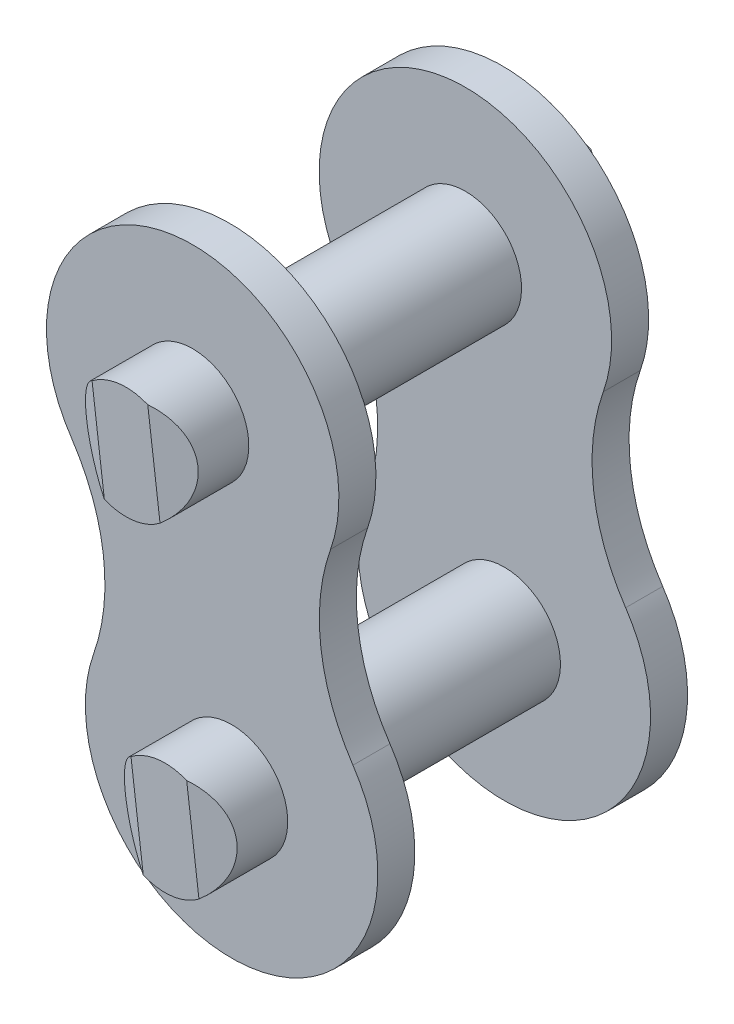
ISO-10303-21;
HEADER;
FILE_DESCRIPTION(('STEP AP214'),'2;1');
FILE_NAME('part.step','',(''),(''),'','','');
FILE_SCHEMA(('AUTOMOTIVE_DESIGN { 1 0 10303 214 1 1 1 1 }'));
ENDSEC;
DATA;
#1=APPLICATION_CONTEXT('core data for automotive mechanical design processes');
#2=APPLICATION_PROTOCOL_DEFINITION('international standard','automotive_design',2000,#1);
#3=PRODUCT_CONTEXT('',#1,'mechanical');
#4=PRODUCT('Part','Part','',(#3));
#5=PRODUCT_RELATED_PRODUCT_CATEGORY('part','',(#4));
#6=PRODUCT_DEFINITION_FORMATION('','',#4);
#7=PRODUCT_DEFINITION_CONTEXT('part definition',#1,'design');
#8=PRODUCT_DEFINITION('design','',#6,#7);
#9=PRODUCT_DEFINITION_SHAPE('','',#8);
#10=(LENGTH_UNIT() NAMED_UNIT(*) SI_UNIT(.MILLI.,.METRE.));
#11=(NAMED_UNIT(*) PLANE_ANGLE_UNIT() SI_UNIT($,.RADIAN.));
#12=(NAMED_UNIT(*) SI_UNIT($,.STERADIAN.) SOLID_ANGLE_UNIT());
#13=UNCERTAINTY_MEASURE_WITH_UNIT(LENGTH_MEASURE(1.E-05),#10,'distance_accuracy_value','');
#14=(GEOMETRIC_REPRESENTATION_CONTEXT(3) GLOBAL_UNCERTAINTY_ASSIGNED_CONTEXT((#13)) GLOBAL_UNIT_ASSIGNED_CONTEXT((#10,
#11,#12)) REPRESENTATION_CONTEXT('',''));
#15=CARTESIAN_POINT('',(0.,0.,0.));
#16=DIRECTION('',(0.,0.,1.));
#17=DIRECTION('',(1.,0.,0.));
#18=AXIS2_PLACEMENT_3D('',#15,#16,#17);
#19=CARTESIAN_POINT('',(84.5620491825673,83.6866241505442,-131.392489073474));
#20=DIRECTION('',(0.496004780892395,0.0630813548672462,0.866025403784439));
#21=DIRECTION('',(0.126162709734492,-0.99200956178479,0.));
#22=AXIS2_PLACEMENT_3D('',#19,#20,#21);
#23=PLANE('',#22);
#24=CARTESIAN_POINT('',(83.5922035314926,98.1827550847188,-131.892921853051));
#25=DIRECTION('',(-0.496004780892394,-0.0630813548672461,-0.866025403784439));
#26=DIRECTION('',(-0.859105481302697,-0.109260111640353,0.5));
#27=AXIS2_PLACEMENT_3D('',#24,#25,#26);
#28=ELLIPSE('',#27,1.3344874122049,1.1557);
#29=CARTESIAN_POINT('',(83.145242717238,97.1169837581572,-131.5593));
#30=VERTEX_POINT('',#29);
#31=CARTESIAN_POINT('',(82.8926988951925,99.1027201676403,-131.5593));
#32=VERTEX_POINT('',#31);
#33=EDGE_CURVE('E255',#30,#32,#28,.T.);
#34=ORIENTED_EDGE('',*,*,#33,.T.);
#35=DIRECTION('',(-0.126162709734492,0.99200956178479,0.));
#36=VECTOR('',#35,1.);
#37=CARTESIAN_POINT('',(84.8486655452059,83.7230757114542,-131.5593));
#38=LINE('',#37,#36);
#39=EDGE_CURVE('E276',#30,#32,#38,.T.);
#40=ORIENTED_EDGE('',*,*,#39,.F.);
#41=EDGE_LOOP('',(#34,#40));
#42=FACE_BOUND('',#41,.T.);
#43=ADVANCED_FACE('F17',(#42),#23,.F.);
#44=CARTESIAN_POINT('',(86.2817473583993,83.9053335160044,-131.392489073474));
#45=DIRECTION('',(0.496004780892396,0.0630813548672464,-0.866025403784438));
#46=DIRECTION('',(0.,-0.997357671646627,-0.0726476070329821));
#47=AXIS2_PLACEMENT_3D('',#44,#45,#46);
#48=PLANE('',#47);
#49=CARTESIAN_POINT('',(83.5922035314926,98.1827550847188,-131.892921853051));
#50=DIRECTION('',(-0.496004780892395,-0.0630813548672463,0.866025403784439));
#51=DIRECTION('',(0.859105481302696,0.109260111640353,0.5));
#52=AXIS2_PLACEMENT_3D('',#49,#50,#51);
#53=ELLIPSE('',#52,1.3344874122049,1.1557);
#54=CARTESIAN_POINT('',(84.2917081677927,97.2627900017974,-131.5593));
#55=VERTEX_POINT('',#54);
#56=CARTESIAN_POINT('',(84.0391643457472,99.2485264112804,-131.5593));
#57=VERTEX_POINT('',#56);
#58=EDGE_CURVE('E243',#55,#57,#53,.T.);
#59=ORIENTED_EDGE('',*,*,#58,.F.);
#60=DIRECTION('',(-0.126162709734492,0.99200956178479,0.));
#61=VECTOR('',#60,1.);
#62=CARTESIAN_POINT('',(85.9951309957606,83.8688819550943,-131.5593));
#63=LINE('',#62,#61);
#64=EDGE_CURVE('E279',#55,#57,#63,.T.);
#65=ORIENTED_EDGE('',*,*,#64,.T.);
#66=EDGE_LOOP('',(#59,#65));
#67=FACE_BOUND('',#66,.T.);
#68=ADVANCED_FACE('F416',(#67),#48,.T.);
#69=CARTESIAN_POINT('',(84.5620491825673,83.6866241505442,-131.392489073474));
#70=DIRECTION('',(0.496004780892395,0.0630813548672462,0.866025403784439));
#71=DIRECTION('',(0.126162709734492,-0.99200956178479,0.));
#72=AXIS2_PLACEMENT_3D('',#69,#70,#71);
#73=PLANE('',#72);
#74=CARTESIAN_POINT('',(82.7910703246785,104.482015802052,-131.892921853051));
#75=DIRECTION('',(-0.496004780892394,-0.0630813548672461,-0.866025403784439));
#76=DIRECTION('',(-0.859105481302697,-0.109260111640353,0.5));
#77=AXIS2_PLACEMENT_3D('',#74,#75,#76);
#78=ELLIPSE('',#77,1.3344874122049,1.1557);
#79=CARTESIAN_POINT('',(82.344109510424,103.416244475491,-131.5593));
#80=VERTEX_POINT('',#79);
#81=CARTESIAN_POINT('',(82.0915656883785,105.401980884974,-131.5593));
#82=VERTEX_POINT('',#81);
#83=EDGE_CURVE('E269',#80,#82,#78,.T.);
#84=ORIENTED_EDGE('',*,*,#83,.T.);
#85=DIRECTION('',(-0.126162709734492,0.99200956178479,0.));
#86=VECTOR('',#85,1.);
#87=CARTESIAN_POINT('',(84.8486655452059,83.7230757114542,-131.5593));
#88=LINE('',#87,#86);
#89=EDGE_CURVE('E259',#80,#82,#88,.T.);
#90=ORIENTED_EDGE('',*,*,#89,.F.);
#91=EDGE_LOOP('',(#84,#90));
#92=FACE_BOUND('',#91,.T.);
#93=ADVANCED_FACE('F422',(#92),#73,.F.);
#94=CARTESIAN_POINT('',(86.2817473583993,83.9053335160044,-131.392489073474));
#95=DIRECTION('',(0.496004780892396,0.0630813548672464,-0.866025403784438));
#96=DIRECTION('',(0.,-0.997357671646627,-0.0726476070329821));
#97=AXIS2_PLACEMENT_3D('',#94,#95,#96);
#98=PLANE('',#97);
#99=CARTESIAN_POINT('',(82.7910703246785,104.482015802052,-131.892921853051));
#100=DIRECTION('',(-0.496004780892395,-0.0630813548672463,0.866025403784439));
#101=DIRECTION('',(0.859105481302696,0.109260111640353,0.5));
#102=AXIS2_PLACEMENT_3D('',#99,#100,#101);
#103=ELLIPSE('',#102,1.3344874122049,1.1557);
#104=CARTESIAN_POINT('',(83.4905749609786,103.562050719131,-131.5593));
#105=VERTEX_POINT('',#104);
#106=CARTESIAN_POINT('',(83.2380311389331,105.547787128614,-131.5593));
#107=VERTEX_POINT('',#106);
#108=EDGE_CURVE('E268',#105,#107,#103,.T.);
#109=ORIENTED_EDGE('',*,*,#108,.F.);
#110=DIRECTION('',(-0.126162709734492,0.99200956178479,0.));
#111=VECTOR('',#110,1.);
#112=CARTESIAN_POINT('',(85.9951309957606,83.8688819550943,-131.5593));
#113=LINE('',#112,#111);
#114=EDGE_CURVE('E262',#105,#107,#113,.T.);
#115=ORIENTED_EDGE('',*,*,#114,.T.);
#116=EDGE_LOOP('',(#109,#115));
#117=FACE_BOUND('',#116,.T.);
#118=ADVANCED_FACE('F465',(#117),#98,.T.);
#119=CARTESIAN_POINT('',(83.1916369280856,101.332385443386,-129.4257));
#120=DIRECTION('',(0.,0.,-1.));
#121=DIRECTION('',(0.,-1.,0.));
#122=AXIS2_PLACEMENT_3D('',#119,#120,#121);
#123=PLANE('',#122);
#124=CARTESIAN_POINT('',(83.5922035314926,98.1827550847188,-129.4257));
#125=DIRECTION('',(0.,0.,1.));
#126=DIRECTION('',(-0.126162709734492,0.99200956178479,0.));
#127=AXIS2_PLACEMENT_3D('',#124,#125,#126);
#128=CIRCLE('',#127,1.1557);
#129=CARTESIAN_POINT('',(83.4463972878525,99.3292205352735,-129.4257));
#130=VERTEX_POINT('',#129);
#131=EDGE_CURVE('E256',#130,#130,#128,.T.);
#132=ORIENTED_EDGE('',*,*,#131,.F.);
#133=EDGE_LOOP('',(#132));
#134=FACE_BOUND('',#133,.T.);
#135=CARTESIAN_POINT('',(82.7910703246785,104.482015802052,-129.4257));
#136=DIRECTION('',(0.,0.,1.));
#137=DIRECTION('',(-0.126162709734492,0.99200956178479,0.));
#138=AXIS2_PLACEMENT_3D('',#135,#136,#137);
#139=CIRCLE('',#138,1.1557);
#140=CARTESIAN_POINT('',(82.6452640810384,105.628481252607,-129.4257));
#141=VERTEX_POINT('',#140);
#142=EDGE_CURVE('E251',#141,#141,#139,.T.);
#143=ORIENTED_EDGE('',*,*,#142,.F.);
#144=EDGE_LOOP('',(#143));
#145=FACE_BOUND('',#144,.T.);
#146=CARTESIAN_POINT('',(89.4631955168003,102.129995523259,-129.4257));
#147=DIRECTION('',(0.,0.,1.));
#148=DIRECTION('',(-0.126162709734492,0.99200956178479,0.));
#149=AXIS2_PLACEMENT_3D('',#146,#147,#148);
#150=CIRCLE('',#149,4.06464973628698);
#151=CARTESIAN_POINT('',(85.6297569357515,103.481337864794,-129.4257));
#152=VERTEX_POINT('',#151);
#153=CARTESIAN_POINT('',(86.0900443037383,99.8621268382347,-129.4257));
#154=VERTEX_POINT('',#153);
#155=EDGE_CURVE('E299',#152,#154,#150,.T.);
#156=ORIENTED_EDGE('',*,*,#155,.F.);
#157=CARTESIAN_POINT('',(82.7910703246785,104.482015802052,-129.4257));
#158=DIRECTION('',(0.,0.,1.));
#159=DIRECTION('',(-0.126162709734492,0.99200956178479,0.));
#160=AXIS2_PLACEMENT_3D('',#157,#158,#159);
#161=CIRCLE('',#160,3.0099);
#162=CARTESIAN_POINT('',(80.2932295524328,102.802644048536,-129.4257));
#163=VERTEX_POINT('',#162);
#164=EDGE_CURVE('E287',#152,#163,#161,.T.);
#165=ORIENTED_EDGE('',*,*,#164,.T.);
#166=CARTESIAN_POINT('',(76.9200783393709,100.534775363512,-129.4257));
#167=DIRECTION('',(0.,0.,1.));
#168=DIRECTION('',(-0.126162709734492,0.99200956178479,0.));
#169=AXIS2_PLACEMENT_3D('',#166,#167,#168);
#170=CIRCLE('',#169,4.06464973628691);
#171=CARTESIAN_POINT('',(80.7535169204197,99.1834330219771,-129.4257));
#172=VERTEX_POINT('',#171);
#173=EDGE_CURVE('E313',#172,#163,#170,.T.);
#174=ORIENTED_EDGE('',*,*,#173,.F.);
#175=CARTESIAN_POINT('',(83.5922035314926,98.1827550847188,-129.4257));
#176=DIRECTION('',(0.,0.,1.));
#177=DIRECTION('',(-0.126162709734492,0.99200956178479,0.));
#178=AXIS2_PLACEMENT_3D('',#175,#176,#177);
#179=CIRCLE('',#178,3.0099);
#180=EDGE_CURVE('E25',#172,#154,#179,.T.);
#181=ORIENTED_EDGE('',*,*,#180,.T.);
#182=EDGE_LOOP('',(#156,#165,#174,#181));
#183=FACE_BOUND('',#182,.T.);
#184=ADVANCED_FACE('F329',(#134,#145,#183),#123,.F.);
#185=CARTESIAN_POINT('',(83.1916369280856,101.332385443386,-130.1877));
#186=DIRECTION('',(0.,0.,-1.));
#187=DIRECTION('',(0.,-1.,0.));
#188=AXIS2_PLACEMENT_3D('',#185,#186,#187);
#189=PLANE('',#188);
#190=CARTESIAN_POINT('',(83.5922035314926,98.1827550847188,-130.1877));
#191=DIRECTION('',(0.,0.,1.));
#192=DIRECTION('',(-0.126162709734492,0.99200956178479,0.));
#193=AXIS2_PLACEMENT_3D('',#190,#191,#192);
#194=CIRCLE('',#193,1.1557);
#195=CARTESIAN_POINT('',(83.4463972878525,99.3292205352735,-130.1877));
#196=VERTEX_POINT('',#195);
#197=EDGE_CURVE('E252',#196,#196,#194,.T.);
#198=ORIENTED_EDGE('',*,*,#197,.T.);
#199=EDGE_LOOP('',(#198));
#200=FACE_BOUND('',#199,.T.);
#201=CARTESIAN_POINT('',(82.7910703246785,104.482015802052,-130.1877));
#202=DIRECTION('',(0.,0.,1.));
#203=DIRECTION('',(-0.126162709734492,0.99200956178479,0.));
#204=AXIS2_PLACEMENT_3D('',#201,#202,#203);
#205=CIRCLE('',#204,1.1557);
#206=CARTESIAN_POINT('',(82.6452640810384,105.628481252607,-130.1877));
#207=VERTEX_POINT('',#206);
#208=EDGE_CURVE('E282',#207,#207,#205,.T.);
#209=ORIENTED_EDGE('',*,*,#208,.T.);
#210=EDGE_LOOP('',(#209));
#211=FACE_BOUND('',#210,.T.);
#212=CARTESIAN_POINT('',(89.4631955168003,102.129995523259,-130.1877));
#213=DIRECTION('',(0.,0.,1.));
#214=DIRECTION('',(-0.126162709734492,0.99200956178479,0.));
#215=AXIS2_PLACEMENT_3D('',#212,#213,#214);
#216=CIRCLE('',#215,4.06464973628698);
#217=CARTESIAN_POINT('',(85.6297569357515,103.481337864794,-130.1877));
#218=VERTEX_POINT('',#217);
#219=CARTESIAN_POINT('',(86.0900443037383,99.8621268382347,-130.1877));
#220=VERTEX_POINT('',#219);
#221=EDGE_CURVE('E288',#218,#220,#216,.T.);
#222=ORIENTED_EDGE('',*,*,#221,.T.);
#223=CARTESIAN_POINT('',(83.5922035314926,98.1827550847188,-130.1877));
#224=DIRECTION('',(0.,0.,1.));
#225=DIRECTION('',(-0.126162709734492,0.99200956178479,0.));
#226=AXIS2_PLACEMENT_3D('',#223,#224,#225);
#227=CIRCLE('',#226,3.0099);
#228=CARTESIAN_POINT('',(80.7535169204197,99.1834330219771,-130.1877));
#229=VERTEX_POINT('',#228);
#230=EDGE_CURVE('E11',#229,#220,#227,.T.);
#231=ORIENTED_EDGE('',*,*,#230,.F.);
#232=CARTESIAN_POINT('',(76.9200783393709,100.534775363512,-130.1877));
#233=DIRECTION('',(0.,0.,1.));
#234=DIRECTION('',(-0.126162709734492,0.99200956178479,0.));
#235=AXIS2_PLACEMENT_3D('',#232,#233,#234);
#236=CIRCLE('',#235,4.06464973628691);
#237=CARTESIAN_POINT('',(80.2932295524328,102.802644048536,-130.1877));
#238=VERTEX_POINT('',#237);
#239=EDGE_CURVE('E319',#229,#238,#236,.T.);
#240=ORIENTED_EDGE('',*,*,#239,.T.);
#241=CARTESIAN_POINT('',(82.7910703246785,104.482015802052,-130.1877));
#242=DIRECTION('',(0.,0.,1.));
#243=DIRECTION('',(-0.126162709734492,0.99200956178479,0.));
#244=AXIS2_PLACEMENT_3D('',#241,#242,#243);
#245=CIRCLE('',#244,3.0099);
#246=EDGE_CURVE('E308',#218,#238,#245,.T.);
#247=ORIENTED_EDGE('',*,*,#246,.F.);
#248=EDGE_LOOP('',(#222,#231,#240,#247));
#249=FACE_BOUND('',#248,.T.);
#250=ADVANCED_FACE('F459',(#200,#211,#249),#189,.T.);
#251=CARTESIAN_POINT('',(83.5922035314926,98.1827550847188,-130.1877));
#252=DIRECTION('',(0.,0.,1.));
#253=DIRECTION('',(0.126162709734492,-0.99200956178479,0.));
#254=AXIS2_PLACEMENT_3D('',#251,#252,#253);
#255=CYLINDRICAL_SURFACE('',#254,3.0099);
#256=ORIENTED_EDGE('',*,*,#180,.F.);
#257=DIRECTION('',(0.,0.,1.));
#258=VECTOR('',#257,1.);
#259=CARTESIAN_POINT('',(80.7535169204197,99.1834330219771,-130.1877));
#260=LINE('',#259,#258);
#261=EDGE_CURVE('E322',#229,#172,#260,.T.);
#262=ORIENTED_EDGE('',*,*,#261,.F.);
#263=ORIENTED_EDGE('',*,*,#230,.T.);
#264=DIRECTION('',(0.,0.,1.));
#265=VECTOR('',#264,1.);
#266=CARTESIAN_POINT('',(86.0900443037383,99.8621268382347,-130.1877));
#267=LINE('',#266,#265);
#268=EDGE_CURVE('E300',#220,#154,#267,.T.);
#269=ORIENTED_EDGE('',*,*,#268,.T.);
#270=EDGE_LOOP('',(#256,#262,#263,#269));
#271=FACE_BOUND('',#270,.T.);
#272=ADVANCED_FACE('F332',(#271),#255,.T.);
#273=CARTESIAN_POINT('',(76.9200783393709,100.534775363512,-130.1877));
#274=DIRECTION('',(0.,0.,1.));
#275=DIRECTION('',(0.126162709734492,-0.99200956178479,0.));
#276=AXIS2_PLACEMENT_3D('',#273,#274,#275);
#277=CYLINDRICAL_SURFACE('',#276,4.06464973628691);
#278=ORIENTED_EDGE('',*,*,#173,.T.);
#279=DIRECTION('',(0.,0.,1.));
#280=VECTOR('',#279,1.);
#281=CARTESIAN_POINT('',(80.2932295524328,102.802644048536,-130.1877));
#282=LINE('',#281,#280);
#283=EDGE_CURVE('E309',#238,#163,#282,.T.);
#284=ORIENTED_EDGE('',*,*,#283,.F.);
#285=ORIENTED_EDGE('',*,*,#239,.F.);
#286=ORIENTED_EDGE('',*,*,#261,.T.);
#287=EDGE_LOOP('',(#278,#284,#285,#286));
#288=FACE_BOUND('',#287,.T.);
#289=ADVANCED_FACE('F453',(#288),#277,.F.);
#290=CARTESIAN_POINT('',(82.7910703246785,104.482015802052,-130.1877));
#291=DIRECTION('',(0.,0.,1.));
#292=DIRECTION('',(0.126162709734492,-0.99200956178479,0.));
#293=AXIS2_PLACEMENT_3D('',#290,#291,#292);
#294=CYLINDRICAL_SURFACE('',#293,3.0099);
#295=ORIENTED_EDGE('',*,*,#164,.F.);
#296=DIRECTION('',(0.,0.,1.));
#297=VECTOR('',#296,1.);
#298=CARTESIAN_POINT('',(85.6297569357515,103.481337864794,-130.1877));
#299=LINE('',#298,#297);
#300=EDGE_CURVE('E283',#218,#152,#299,.T.);
#301=ORIENTED_EDGE('',*,*,#300,.F.);
#302=ORIENTED_EDGE('',*,*,#246,.T.);
#303=ORIENTED_EDGE('',*,*,#283,.T.);
#304=EDGE_LOOP('',(#295,#301,#302,#303));
#305=FACE_BOUND('',#304,.T.);
#306=ADVANCED_FACE('F452',(#305),#294,.T.);
#307=CARTESIAN_POINT('',(89.4631955168003,102.129995523259,-130.1877));
#308=DIRECTION('',(0.,0.,1.));
#309=DIRECTION('',(0.126162709734492,-0.99200956178479,0.));
#310=AXIS2_PLACEMENT_3D('',#307,#308,#309);
#311=CYLINDRICAL_SURFACE('',#310,4.06464973628698);
#312=ORIENTED_EDGE('',*,*,#155,.T.);
#313=ORIENTED_EDGE('',*,*,#268,.F.);
#314=ORIENTED_EDGE('',*,*,#221,.F.);
#315=ORIENTED_EDGE('',*,*,#300,.T.);
#316=EDGE_LOOP('',(#312,#313,#314,#315));
#317=FACE_BOUND('',#316,.T.);
#318=ADVANCED_FACE('F335',(#317),#311,.F.);
#319=CARTESIAN_POINT('',(83.1916369280856,101.332385443386,-131.5593));
#320=DIRECTION('',(0.,0.,-1.));
#321=DIRECTION('',(0.,-1.,0.));
#322=AXIS2_PLACEMENT_3D('',#319,#320,#321);
#323=PLANE('',#322);
#324=ORIENTED_EDGE('',*,*,#89,.T.);
#325=CARTESIAN_POINT('',(82.7910703246785,104.482015802052,-131.5593));
#326=DIRECTION('',(0.,0.,1.));
#327=DIRECTION('',(-0.126162709734492,0.99200956178479,0.));
#328=AXIS2_PLACEMENT_3D('',#325,#326,#327);
#329=CIRCLE('',#328,1.1557);
#330=EDGE_CURVE('E263',#107,#82,#329,.T.);
#331=ORIENTED_EDGE('',*,*,#330,.F.);
#332=ORIENTED_EDGE('',*,*,#114,.F.);
#333=CARTESIAN_POINT('',(82.7910703246785,104.482015802052,-131.5593));
#334=DIRECTION('',(0.,0.,1.));
#335=DIRECTION('',(-0.126162709734492,0.99200956178479,0.));
#336=AXIS2_PLACEMENT_3D('',#333,#334,#335);
#337=CIRCLE('',#336,1.1557);
#338=EDGE_CURVE('E264',#80,#105,#337,.T.);
#339=ORIENTED_EDGE('',*,*,#338,.F.);
#340=EDGE_LOOP('',(#324,#331,#332,#339));
#341=FACE_BOUND('',#340,.T.);
#342=ADVANCED_FACE('F442',(#341),#323,.T.);
#343=CARTESIAN_POINT('',(82.7910703246785,104.482015802052,-131.5593));
#344=DIRECTION('',(0.,0.,1.));
#345=DIRECTION('',(0.126162709734492,-0.99200956178479,0.));
#346=AXIS2_PLACEMENT_3D('',#343,#344,#345);
#347=CYLINDRICAL_SURFACE('',#346,1.1557);
#348=ORIENTED_EDGE('',*,*,#83,.F.);
#349=ORIENTED_EDGE('',*,*,#338,.T.);
#350=ORIENTED_EDGE('',*,*,#108,.T.);
#351=ORIENTED_EDGE('',*,*,#330,.T.);
#352=EDGE_LOOP('',(#348,#349,#350,#351));
#353=FACE_BOUND('',#352,.T.);
#354=ORIENTED_EDGE('',*,*,#208,.F.);
#355=EDGE_LOOP('',(#354));
#356=FACE_BOUND('',#355,.T.);
#357=ADVANCED_FACE('F434',(#353,#356),#347,.T.);
#358=CARTESIAN_POINT('',(83.1916369280856,101.332385443386,-131.5593));
#359=DIRECTION('',(0.,0.,-1.));
#360=DIRECTION('',(0.,-1.,0.));
#361=AXIS2_PLACEMENT_3D('',#358,#359,#360);
#362=PLANE('',#361);
#363=ORIENTED_EDGE('',*,*,#39,.T.);
#364=CARTESIAN_POINT('',(83.5922035314926,98.1827550847188,-131.5593));
#365=DIRECTION('',(0.,0.,1.));
#366=DIRECTION('',(-0.126162709734492,0.99200956178479,0.));
#367=AXIS2_PLACEMENT_3D('',#364,#365,#366);
#368=CIRCLE('',#367,1.1557);
#369=EDGE_CURVE('E247',#57,#32,#368,.T.);
#370=ORIENTED_EDGE('',*,*,#369,.F.);
#371=ORIENTED_EDGE('',*,*,#64,.F.);
#372=CARTESIAN_POINT('',(83.5922035314926,98.1827550847188,-131.5593));
#373=DIRECTION('',(0.,0.,1.));
#374=DIRECTION('',(-0.126162709734492,0.99200956178479,0.));
#375=AXIS2_PLACEMENT_3D('',#372,#373,#374);
#376=CIRCLE('',#375,1.1557);
#377=EDGE_CURVE('E248',#30,#55,#376,.T.);
#378=ORIENTED_EDGE('',*,*,#377,.F.);
#379=EDGE_LOOP('',(#363,#370,#371,#378));
#380=FACE_BOUND('',#379,.T.);
#381=ADVANCED_FACE('F432',(#380),#362,.T.);
#382=CARTESIAN_POINT('',(83.5922035314926,98.1827550847188,-131.5593));
#383=DIRECTION('',(0.,0.,1.));
#384=DIRECTION('',(0.126162709734492,-0.99200956178479,0.));
#385=AXIS2_PLACEMENT_3D('',#382,#383,#384);
#386=CYLINDRICAL_SURFACE('',#385,1.1557);
#387=ORIENTED_EDGE('',*,*,#33,.F.);
#388=ORIENTED_EDGE('',*,*,#377,.T.);
#389=ORIENTED_EDGE('',*,*,#58,.T.);
#390=ORIENTED_EDGE('',*,*,#369,.T.);
#391=EDGE_LOOP('',(#387,#388,#389,#390));
#392=FACE_BOUND('',#391,.T.);
#393=ORIENTED_EDGE('',*,*,#197,.F.);
#394=EDGE_LOOP('',(#393));
#395=FACE_BOUND('',#394,.T.);
#396=ADVANCED_FACE('F427',(#392,#395),#386,.T.);
#397=CARTESIAN_POINT('',(84.5620491825673,83.6866241505442,-122.607510926526));
#398=DIRECTION('',(0.496004780892395,0.0630813548672462,-0.866025403784439));
#399=DIRECTION('',(0.,-0.997357671646627,-0.0726476070329818));
#400=AXIS2_PLACEMENT_3D('',#397,#398,#399);
#401=PLANE('',#400);
#402=CARTESIAN_POINT('',(83.5922035314926,98.1827550847188,-122.107078146949));
#403=DIRECTION('',(0.496004780892394,0.0630813548672461,-0.866025403784439));
#404=DIRECTION('',(-0.859105481302697,-0.109260111640353,-0.5));
#405=AXIS2_PLACEMENT_3D('',#402,#403,#404);
#406=ELLIPSE('',#405,1.3344874122049,1.1557);
#407=CARTESIAN_POINT('',(83.145242717238,97.1169837581572,-122.4407));
#408=VERTEX_POINT('',#407);
#409=CARTESIAN_POINT('',(82.8926988951925,99.1027201676403,-122.4407));
#410=VERTEX_POINT('',#409);
#411=EDGE_CURVE('E350',#408,#410,#406,.T.);
#412=ORIENTED_EDGE('',*,*,#411,.F.);
#413=DIRECTION('',(-0.126162709734492,0.99200956178479,0.));
#414=VECTOR('',#413,1.);
#415=CARTESIAN_POINT('',(84.8486655452059,83.7230757114542,-122.4407));
#416=LINE('',#415,#414);
#417=EDGE_CURVE('E364',#408,#410,#416,.T.);
#418=ORIENTED_EDGE('',*,*,#417,.T.);
#419=EDGE_LOOP('',(#412,#418));
#420=FACE_BOUND('',#419,.T.);
#421=ADVANCED_FACE('F440',(#420),#401,.F.);
#422=CARTESIAN_POINT('',(86.2817473583993,83.9053335160044,-122.607510926526));
#423=DIRECTION('',(0.496004780892396,0.0630813548672464,0.866025403784438));
#424=DIRECTION('',(0.126162709734492,-0.99200956178479,0.));
#425=AXIS2_PLACEMENT_3D('',#422,#423,#424);
#426=PLANE('',#425);
#427=CARTESIAN_POINT('',(83.5922035314926,98.1827550847188,-122.107078146949));
#428=DIRECTION('',(0.496004780892395,0.0630813548672463,0.866025403784439));
#429=DIRECTION('',(0.859105481302696,0.109260111640353,-0.5));
#430=AXIS2_PLACEMENT_3D('',#427,#428,#429);
#431=ELLIPSE('',#430,1.3344874122049,1.1557);
#432=CARTESIAN_POINT('',(84.2917081677927,97.2627900017974,-122.4407));
#433=VERTEX_POINT('',#432);
#434=CARTESIAN_POINT('',(84.0391643457472,99.2485264112804,-122.4407));
#435=VERTEX_POINT('',#434);
#436=EDGE_CURVE('E349',#433,#435,#431,.T.);
#437=ORIENTED_EDGE('',*,*,#436,.T.);
#438=DIRECTION('',(-0.126162709734492,0.99200956178479,0.));
#439=VECTOR('',#438,1.);
#440=CARTESIAN_POINT('',(85.9951309957606,83.8688819550943,-122.4407));
#441=LINE('',#440,#439);
#442=EDGE_CURVE('E371',#433,#435,#441,.T.);
#443=ORIENTED_EDGE('',*,*,#442,.F.);
#444=EDGE_LOOP('',(#437,#443));
#445=FACE_BOUND('',#444,.T.);
#446=ADVANCED_FACE('F504',(#445),#426,.T.);
#447=CARTESIAN_POINT('',(84.5620491825673,83.6866241505442,-122.607510926526));
#448=DIRECTION('',(0.496004780892395,0.0630813548672462,-0.866025403784439));
#449=DIRECTION('',(0.,-0.997357671646627,-0.0726476070329818));
#450=AXIS2_PLACEMENT_3D('',#447,#448,#449);
#451=PLANE('',#450);
#452=CARTESIAN_POINT('',(82.7910703246785,104.482015802052,-122.107078146949));
#453=DIRECTION('',(0.496004780892394,0.0630813548672461,-0.866025403784439));
#454=DIRECTION('',(-0.859105481302697,-0.109260111640353,-0.5));
#455=AXIS2_PLACEMENT_3D('',#452,#453,#454);
#456=ELLIPSE('',#455,1.3344874122049,1.1557);
#457=CARTESIAN_POINT('',(82.344109510424,103.416244475491,-122.4407));
#458=VERTEX_POINT('',#457);
#459=CARTESIAN_POINT('',(82.0915656883785,105.401980884974,-122.4407));
#460=VERTEX_POINT('',#459);
#461=EDGE_CURVE('E379',#458,#460,#456,.T.);
#462=ORIENTED_EDGE('',*,*,#461,.F.);
#463=DIRECTION('',(-0.126162709734492,0.99200956178479,0.));
#464=VECTOR('',#463,1.);
#465=CARTESIAN_POINT('',(84.8486655452059,83.7230757114542,-122.4407));
#466=LINE('',#465,#464);
#467=EDGE_CURVE('E365',#458,#460,#466,.T.);
#468=ORIENTED_EDGE('',*,*,#467,.T.);
#469=EDGE_LOOP('',(#462,#468));
#470=FACE_BOUND('',#469,.T.);
#471=ADVANCED_FACE('F506',(#470),#451,.F.);
#472=CARTESIAN_POINT('',(86.2817473583993,83.9053335160044,-122.607510926526));
#473=DIRECTION('',(0.496004780892396,0.0630813548672464,0.866025403784438));
#474=DIRECTION('',(0.126162709734492,-0.99200956178479,0.));
#475=AXIS2_PLACEMENT_3D('',#472,#473,#474);
#476=PLANE('',#475);
#477=CARTESIAN_POINT('',(82.7910703246785,104.482015802052,-122.107078146949));
#478=DIRECTION('',(0.496004780892395,0.0630813548672463,0.866025403784439));
#479=DIRECTION('',(0.859105481302696,0.109260111640353,-0.5));
#480=AXIS2_PLACEMENT_3D('',#477,#478,#479);
#481=ELLIPSE('',#480,1.3344874122049,1.1557);
#482=CARTESIAN_POINT('',(83.4905749609786,103.562050719131,-122.4407));
#483=VERTEX_POINT('',#482);
#484=CARTESIAN_POINT('',(83.2380311389331,105.547787128614,-122.4407));
#485=VERTEX_POINT('',#484);
#486=EDGE_CURVE('E386',#483,#485,#481,.T.);
#487=ORIENTED_EDGE('',*,*,#486,.T.);
#488=DIRECTION('',(-0.126162709734492,0.99200956178479,0.));
#489=VECTOR('',#488,1.);
#490=CARTESIAN_POINT('',(85.9951309957606,83.8688819550943,-122.4407));
#491=LINE('',#490,#489);
#492=EDGE_CURVE('E360',#483,#485,#491,.T.);
#493=ORIENTED_EDGE('',*,*,#492,.F.);
#494=EDGE_LOOP('',(#487,#493));
#495=FACE_BOUND('',#494,.T.);
#496=ADVANCED_FACE('F511',(#495),#476,.T.);
#497=CARTESIAN_POINT('',(83.5922035314926,98.1827550847188,-122.4407));
#498=DIRECTION('',(0.,0.,-1.));
#499=DIRECTION('',(0.126162709734492,-0.99200956178479,0.));
#500=AXIS2_PLACEMENT_3D('',#497,#498,#499);
#501=CYLINDRICAL_SURFACE('',#500,1.1557);
#502=ORIENTED_EDGE('',*,*,#131,.T.);
#503=EDGE_LOOP('',(#502));
#504=FACE_BOUND('',#503,.T.);
#505=CARTESIAN_POINT('',(83.5922035314926,98.1827550847188,-124.5743));
#506=DIRECTION('',(0.,0.,1.));
#507=DIRECTION('',(-0.126162709734492,0.99200956178479,0.));
#508=AXIS2_PLACEMENT_3D('',#505,#506,#507);
#509=CIRCLE('',#508,1.1557);
#510=CARTESIAN_POINT('',(83.4463972878525,99.3292205352735,-124.5743));
#511=VERTEX_POINT('',#510);
#512=EDGE_CURVE('E242',#511,#511,#509,.T.);
#513=ORIENTED_EDGE('',*,*,#512,.F.);
#514=EDGE_LOOP('',(#513));
#515=FACE_BOUND('',#514,.T.);
#516=ADVANCED_FACE('F518',(#504,#515),#501,.T.);
#517=CARTESIAN_POINT('',(82.7910703246785,104.482015802052,-122.4407));
#518=DIRECTION('',(0.,0.,-1.));
#519=DIRECTION('',(0.126162709734492,-0.99200956178479,0.));
#520=AXIS2_PLACEMENT_3D('',#517,#518,#519);
#521=CYLINDRICAL_SURFACE('',#520,1.1557);
#522=ORIENTED_EDGE('',*,*,#142,.T.);
#523=EDGE_LOOP('',(#522));
#524=FACE_BOUND('',#523,.T.);
#525=CARTESIAN_POINT('',(82.7910703246785,104.482015802052,-124.5743));
#526=DIRECTION('',(0.,0.,1.));
#527=DIRECTION('',(-0.126162709734492,0.99200956178479,0.));
#528=AXIS2_PLACEMENT_3D('',#525,#526,#527);
#529=CIRCLE('',#528,1.1557);
#530=CARTESIAN_POINT('',(82.6452640810384,105.628481252607,-124.5743));
#531=VERTEX_POINT('',#530);
#532=EDGE_CURVE('E239',#531,#531,#529,.T.);
#533=ORIENTED_EDGE('',*,*,#532,.F.);
#534=EDGE_LOOP('',(#533));
#535=FACE_BOUND('',#534,.T.);
#536=ADVANCED_FACE('F520',(#524,#535),#521,.T.);
#537=CARTESIAN_POINT('',(83.1916369280856,101.332385443386,-124.5743));
#538=DIRECTION('',(0.,0.,1.));
#539=DIRECTION('',(1.,0.,0.));
#540=AXIS2_PLACEMENT_3D('',#537,#538,#539);
#541=PLANE('',#540);
#542=ORIENTED_EDGE('',*,*,#512,.T.);
#543=EDGE_LOOP('',(#542));
#544=FACE_BOUND('',#543,.T.);
#545=ORIENTED_EDGE('',*,*,#532,.T.);
#546=EDGE_LOOP('',(#545));
#547=FACE_BOUND('',#546,.T.);
#548=CARTESIAN_POINT('',(89.4631955168003,102.129995523259,-124.5743));
#549=DIRECTION('',(0.,0.,1.));
#550=DIRECTION('',(-0.126162709734492,0.99200956178479,0.));
#551=AXIS2_PLACEMENT_3D('',#548,#549,#550);
#552=CIRCLE('',#551,4.06464973628698);
#553=CARTESIAN_POINT('',(85.6297569357515,103.481337864794,-124.5743));
#554=VERTEX_POINT('',#553);
#555=CARTESIAN_POINT('',(86.0900443037383,99.8621268382347,-124.5743));
#556=VERTEX_POINT('',#555);
#557=EDGE_CURVE('E355',#554,#556,#552,.T.);
#558=ORIENTED_EDGE('',*,*,#557,.T.);
#559=CARTESIAN_POINT('',(83.5922035314926,98.1827550847188,-124.5743));
#560=DIRECTION('',(0.,0.,1.));
#561=DIRECTION('',(-0.126162709734492,0.99200956178479,0.));
#562=AXIS2_PLACEMENT_3D('',#559,#560,#561);
#563=CIRCLE('',#562,3.0099);
#564=CARTESIAN_POINT('',(80.7535169204197,99.1834330219771,-124.5743));
#565=VERTEX_POINT('',#564);
#566=EDGE_CURVE('E209',#565,#556,#563,.T.);
#567=ORIENTED_EDGE('',*,*,#566,.F.);
#568=CARTESIAN_POINT('',(76.9200783393709,100.534775363512,-124.5743));
#569=DIRECTION('',(0.,0.,1.));
#570=DIRECTION('',(-0.126162709734492,0.99200956178479,0.));
#571=AXIS2_PLACEMENT_3D('',#568,#569,#570);
#572=CIRCLE('',#571,4.06464973628691);
#573=CARTESIAN_POINT('',(80.2932295524328,102.802644048536,-124.5743));
#574=VERTEX_POINT('',#573);
#575=EDGE_CURVE('E220',#565,#574,#572,.T.);
#576=ORIENTED_EDGE('',*,*,#575,.T.);
#577=CARTESIAN_POINT('',(82.7910703246785,104.482015802052,-124.5743));
#578=DIRECTION('',(0.,0.,1.));
#579=DIRECTION('',(-0.126162709734492,0.99200956178479,0.));
#580=AXIS2_PLACEMENT_3D('',#577,#578,#579);
#581=CIRCLE('',#580,3.0099);
#582=EDGE_CURVE('E223',#554,#574,#581,.T.);
#583=ORIENTED_EDGE('',*,*,#582,.F.);
#584=EDGE_LOOP('',(#558,#567,#576,#583));
#585=FACE_BOUND('',#584,.T.);
#586=ADVANCED_FACE('F402',(#544,#547,#585),#541,.F.);
#587=CARTESIAN_POINT('',(83.1916369280856,101.332385443386,-123.8123));
#588=DIRECTION('',(0.,0.,1.));
#589=DIRECTION('',(1.,0.,0.));
#590=AXIS2_PLACEMENT_3D('',#587,#588,#589);
#591=PLANE('',#590);
#592=CARTESIAN_POINT('',(83.5922035314926,98.1827550847188,-123.8123));
#593=DIRECTION('',(0.,0.,1.));
#594=DIRECTION('',(-0.126162709734492,0.99200956178479,0.));
#595=AXIS2_PLACEMENT_3D('',#592,#593,#594);
#596=CIRCLE('',#595,1.1557);
#597=CARTESIAN_POINT('',(83.4463972878525,99.3292205352735,-123.8123));
#598=VERTEX_POINT('',#597);
#599=EDGE_CURVE('E486',#598,#598,#596,.T.);
#600=ORIENTED_EDGE('',*,*,#599,.F.);
#601=EDGE_LOOP('',(#600));
#602=FACE_BOUND('',#601,.T.);
#603=CARTESIAN_POINT('',(82.7910703246785,104.482015802052,-123.8123));
#604=DIRECTION('',(0.,0.,1.));
#605=DIRECTION('',(-0.126162709734492,0.99200956178479,0.));
#606=AXIS2_PLACEMENT_3D('',#603,#604,#605);
#607=CIRCLE('',#606,1.1557);
#608=CARTESIAN_POINT('',(82.6452640810384,105.628481252607,-123.8123));
#609=VERTEX_POINT('',#608);
#610=EDGE_CURVE('E344',#609,#609,#607,.T.);
#611=ORIENTED_EDGE('',*,*,#610,.F.);
#612=EDGE_LOOP('',(#611));
#613=FACE_BOUND('',#612,.T.);
#614=CARTESIAN_POINT('',(89.4631955168003,102.129995523259,-123.8123));
#615=DIRECTION('',(0.,0.,1.));
#616=DIRECTION('',(-0.126162709734492,0.99200956178479,0.));
#617=AXIS2_PLACEMENT_3D('',#614,#615,#616);
#618=CIRCLE('',#617,4.06464973628698);
#619=CARTESIAN_POINT('',(85.6297569357515,103.481337864794,-123.8123));
#620=VERTEX_POINT('',#619);
#621=CARTESIAN_POINT('',(86.0900443037383,99.8621268382347,-123.8123));
#622=VERTEX_POINT('',#621);
#623=EDGE_CURVE('E215',#620,#622,#618,.T.);
#624=ORIENTED_EDGE('',*,*,#623,.F.);
#625=CARTESIAN_POINT('',(82.7910703246785,104.482015802052,-123.8123));
#626=DIRECTION('',(0.,0.,1.));
#627=DIRECTION('',(-0.126162709734492,0.99200956178479,0.));
#628=AXIS2_PLACEMENT_3D('',#625,#626,#627);
#629=CIRCLE('',#628,3.0099);
#630=CARTESIAN_POINT('',(80.2932295524328,102.802644048536,-123.8123));
#631=VERTEX_POINT('',#630);
#632=EDGE_CURVE('E212',#620,#631,#629,.T.);
#633=ORIENTED_EDGE('',*,*,#632,.T.);
#634=CARTESIAN_POINT('',(76.9200783393709,100.534775363512,-123.8123));
#635=DIRECTION('',(0.,0.,1.));
#636=DIRECTION('',(-0.126162709734492,0.99200956178479,0.));
#637=AXIS2_PLACEMENT_3D('',#634,#635,#636);
#638=CIRCLE('',#637,4.06464973628691);
#639=CARTESIAN_POINT('',(80.7535169204197,99.1834330219771,-123.8123));
#640=VERTEX_POINT('',#639);
#641=EDGE_CURVE('E198',#640,#631,#638,.T.);
#642=ORIENTED_EDGE('',*,*,#641,.F.);
#643=CARTESIAN_POINT('',(83.5922035314926,98.1827550847188,-123.8123));
#644=DIRECTION('',(0.,0.,1.));
#645=DIRECTION('',(-0.126162709734492,0.99200956178479,0.));
#646=AXIS2_PLACEMENT_3D('',#643,#644,#645);
#647=CIRCLE('',#646,3.0099);
#648=EDGE_CURVE('E236',#640,#622,#647,.T.);
#649=ORIENTED_EDGE('',*,*,#648,.T.);
#650=EDGE_LOOP('',(#624,#633,#642,#649));
#651=FACE_BOUND('',#650,.T.);
#652=ADVANCED_FACE('F213',(#602,#613,#651),#591,.T.);
#653=CARTESIAN_POINT('',(83.5922035314926,98.1827550847188,-123.8123));
#654=DIRECTION('',(0.,0.,-1.));
#655=DIRECTION('',(0.126162709734492,-0.99200956178479,0.));
#656=AXIS2_PLACEMENT_3D('',#653,#654,#655);
#657=CYLINDRICAL_SURFACE('',#656,3.0099);
#658=ORIENTED_EDGE('',*,*,#566,.T.);
#659=DIRECTION('',(0.,0.,-1.));
#660=VECTOR('',#659,1.);
#661=CARTESIAN_POINT('',(86.0900443037383,99.8621268382347,-123.8123));
#662=LINE('',#661,#660);
#663=EDGE_CURVE('E228',#622,#556,#662,.T.);
#664=ORIENTED_EDGE('',*,*,#663,.F.);
#665=ORIENTED_EDGE('',*,*,#648,.F.);
#666=DIRECTION('',(0.,0.,-1.));
#667=VECTOR('',#666,1.);
#668=CARTESIAN_POINT('',(80.7535169204197,99.1834330219771,-123.8123));
#669=LINE('',#668,#667);
#670=EDGE_CURVE('E206',#640,#565,#669,.T.);
#671=ORIENTED_EDGE('',*,*,#670,.T.);
#672=EDGE_LOOP('',(#658,#664,#665,#671));
#673=FACE_BOUND('',#672,.T.);
#674=ADVANCED_FACE('F403',(#673),#657,.T.);
#675=CARTESIAN_POINT('',(76.9200783393709,100.534775363512,-123.8123));
#676=DIRECTION('',(0.,0.,-1.));
#677=DIRECTION('',(0.126162709734492,-0.99200956178479,0.));
#678=AXIS2_PLACEMENT_3D('',#675,#676,#677);
#679=CYLINDRICAL_SURFACE('',#678,4.06464973628691);
#680=ORIENTED_EDGE('',*,*,#575,.F.);
#681=ORIENTED_EDGE('',*,*,#670,.F.);
#682=ORIENTED_EDGE('',*,*,#641,.T.);
#683=DIRECTION('',(0.,0.,-1.));
#684=VECTOR('',#683,1.);
#685=CARTESIAN_POINT('',(80.2932295524328,102.802644048536,-123.8123));
#686=LINE('',#685,#684);
#687=EDGE_CURVE('E203',#631,#574,#686,.T.);
#688=ORIENTED_EDGE('',*,*,#687,.T.);
#689=EDGE_LOOP('',(#680,#681,#682,#688));
#690=FACE_BOUND('',#689,.T.);
#691=ADVANCED_FACE('F201',(#690),#679,.F.);
#692=CARTESIAN_POINT('',(82.7910703246785,104.482015802052,-123.8123));
#693=DIRECTION('',(0.,0.,-1.));
#694=DIRECTION('',(0.126162709734492,-0.99200956178479,0.));
#695=AXIS2_PLACEMENT_3D('',#692,#693,#694);
#696=CYLINDRICAL_SURFACE('',#695,3.0099);
#697=ORIENTED_EDGE('',*,*,#582,.T.);
#698=ORIENTED_EDGE('',*,*,#687,.F.);
#699=ORIENTED_EDGE('',*,*,#632,.F.);
#700=DIRECTION('',(0.,0.,-1.));
#701=VECTOR('',#700,1.);
#702=CARTESIAN_POINT('',(85.6297569357515,103.481337864794,-123.8123));
#703=LINE('',#702,#701);
#704=EDGE_CURVE('E359',#620,#554,#703,.T.);
#705=ORIENTED_EDGE('',*,*,#704,.T.);
#706=EDGE_LOOP('',(#697,#698,#699,#705));
#707=FACE_BOUND('',#706,.T.);
#708=ADVANCED_FACE('F222',(#707),#696,.T.);
#709=CARTESIAN_POINT('',(89.4631955168003,102.129995523259,-123.8123));
#710=DIRECTION('',(0.,0.,-1.));
#711=DIRECTION('',(0.126162709734492,-0.99200956178479,0.));
#712=AXIS2_PLACEMENT_3D('',#709,#710,#711);
#713=CYLINDRICAL_SURFACE('',#712,4.06464973628698);
#714=ORIENTED_EDGE('',*,*,#557,.F.);
#715=ORIENTED_EDGE('',*,*,#704,.F.);
#716=ORIENTED_EDGE('',*,*,#623,.T.);
#717=ORIENTED_EDGE('',*,*,#663,.T.);
#718=EDGE_LOOP('',(#714,#715,#716,#717));
#719=FACE_BOUND('',#718,.T.);
#720=ADVANCED_FACE('F399',(#719),#713,.F.);
#721=CARTESIAN_POINT('',(83.1916369280856,101.332385443386,-122.4407));
#722=DIRECTION('',(0.,0.,1.));
#723=DIRECTION('',(1.,0.,0.));
#724=AXIS2_PLACEMENT_3D('',#721,#722,#723);
#725=PLANE('',#724);
#726=ORIENTED_EDGE('',*,*,#467,.F.);
#727=CARTESIAN_POINT('',(82.7910703246785,104.482015802052,-122.4407));
#728=DIRECTION('',(0.,0.,1.));
#729=DIRECTION('',(-0.126162709734492,0.99200956178479,0.));
#730=AXIS2_PLACEMENT_3D('',#727,#728,#729);
#731=CIRCLE('',#730,1.1557);
#732=EDGE_CURVE('E368',#458,#483,#731,.T.);
#733=ORIENTED_EDGE('',*,*,#732,.T.);
#734=ORIENTED_EDGE('',*,*,#492,.T.);
#735=CARTESIAN_POINT('',(82.7910703246785,104.482015802052,-122.4407));
#736=DIRECTION('',(0.,0.,1.));
#737=DIRECTION('',(-0.126162709734492,0.99200956178479,0.));
#738=AXIS2_PLACEMENT_3D('',#735,#736,#737);
#739=CIRCLE('',#738,1.1557);
#740=EDGE_CURVE('E383',#485,#460,#739,.T.);
#741=ORIENTED_EDGE('',*,*,#740,.T.);
#742=EDGE_LOOP('',(#726,#733,#734,#741));
#743=FACE_BOUND('',#742,.T.);
#744=ADVANCED_FACE('F572',(#743),#725,.T.);
#745=CARTESIAN_POINT('',(82.7910703246785,104.482015802052,-122.4407));
#746=DIRECTION('',(0.,0.,-1.));
#747=DIRECTION('',(0.126162709734492,-0.99200956178479,0.));
#748=AXIS2_PLACEMENT_3D('',#745,#746,#747);
#749=CYLINDRICAL_SURFACE('',#748,1.1557);
#750=ORIENTED_EDGE('',*,*,#461,.T.);
#751=ORIENTED_EDGE('',*,*,#740,.F.);
#752=ORIENTED_EDGE('',*,*,#486,.F.);
#753=ORIENTED_EDGE('',*,*,#732,.F.);
#754=EDGE_LOOP('',(#750,#751,#752,#753));
#755=FACE_BOUND('',#754,.T.);
#756=ORIENTED_EDGE('',*,*,#610,.T.);
#757=EDGE_LOOP('',(#756));
#758=FACE_BOUND('',#757,.T.);
#759=ADVANCED_FACE('F586',(#755,#758),#749,.T.);
#760=CARTESIAN_POINT('',(83.1916369280856,101.332385443386,-122.4407));
#761=DIRECTION('',(0.,0.,1.));
#762=DIRECTION('',(1.,0.,0.));
#763=AXIS2_PLACEMENT_3D('',#760,#761,#762);
#764=PLANE('',#763);
#765=ORIENTED_EDGE('',*,*,#417,.F.);
#766=CARTESIAN_POINT('',(83.5922035314926,98.1827550847188,-122.4407));
#767=DIRECTION('',(0.,0.,1.));
#768=DIRECTION('',(-0.126162709734492,0.99200956178479,0.));
#769=AXIS2_PLACEMENT_3D('',#766,#767,#768);
#770=CIRCLE('',#769,1.1557);
#771=EDGE_CURVE('E354',#408,#433,#770,.T.);
#772=ORIENTED_EDGE('',*,*,#771,.T.);
#773=ORIENTED_EDGE('',*,*,#442,.T.);
#774=CARTESIAN_POINT('',(83.5922035314926,98.1827550847188,-122.4407));
#775=DIRECTION('',(0.,0.,1.));
#776=DIRECTION('',(-0.126162709734492,0.99200956178479,0.));
#777=AXIS2_PLACEMENT_3D('',#774,#775,#776);
#778=CIRCLE('',#777,1.1557);
#779=EDGE_CURVE('E346',#435,#410,#778,.T.);
#780=ORIENTED_EDGE('',*,*,#779,.T.);
#781=EDGE_LOOP('',(#765,#772,#773,#780));
#782=FACE_BOUND('',#781,.T.);
#783=ADVANCED_FACE('F502',(#782),#764,.T.);
#784=CARTESIAN_POINT('',(83.5922035314926,98.1827550847188,-122.4407));
#785=DIRECTION('',(0.,0.,-1.));
#786=DIRECTION('',(0.126162709734492,-0.99200956178479,0.));
#787=AXIS2_PLACEMENT_3D('',#784,#785,#786);
#788=CYLINDRICAL_SURFACE('',#787,1.1557);
#789=ORIENTED_EDGE('',*,*,#411,.T.);
#790=ORIENTED_EDGE('',*,*,#779,.F.);
#791=ORIENTED_EDGE('',*,*,#436,.F.);
#792=ORIENTED_EDGE('',*,*,#771,.F.);
#793=EDGE_LOOP('',(#789,#790,#791,#792));
#794=FACE_BOUND('',#793,.T.);
#795=ORIENTED_EDGE('',*,*,#599,.T.);
#796=EDGE_LOOP('',(#795));
#797=FACE_BOUND('',#796,.T.);
#798=ADVANCED_FACE('F497',(#794,#797),#788,.T.);
#799=CLOSED_SHELL('',(#43,#68,#93,#118,#184,#250,#272,#289,#306,#318,#342,#357,#381,#396,#421,
#446,#471,#496,#516,#536,#586,#652,#674,#691,#708,#720,#744,#759,#783,#798));
#800=MANIFOLD_SOLID_BREP('B1',#799);
#801=ADVANCED_BREP_SHAPE_REPRESENTATION('',(#18,#800),#14);
#802=SHAPE_DEFINITION_REPRESENTATION(#9,#801);
ENDSEC;
END-ISO-10303-21;
